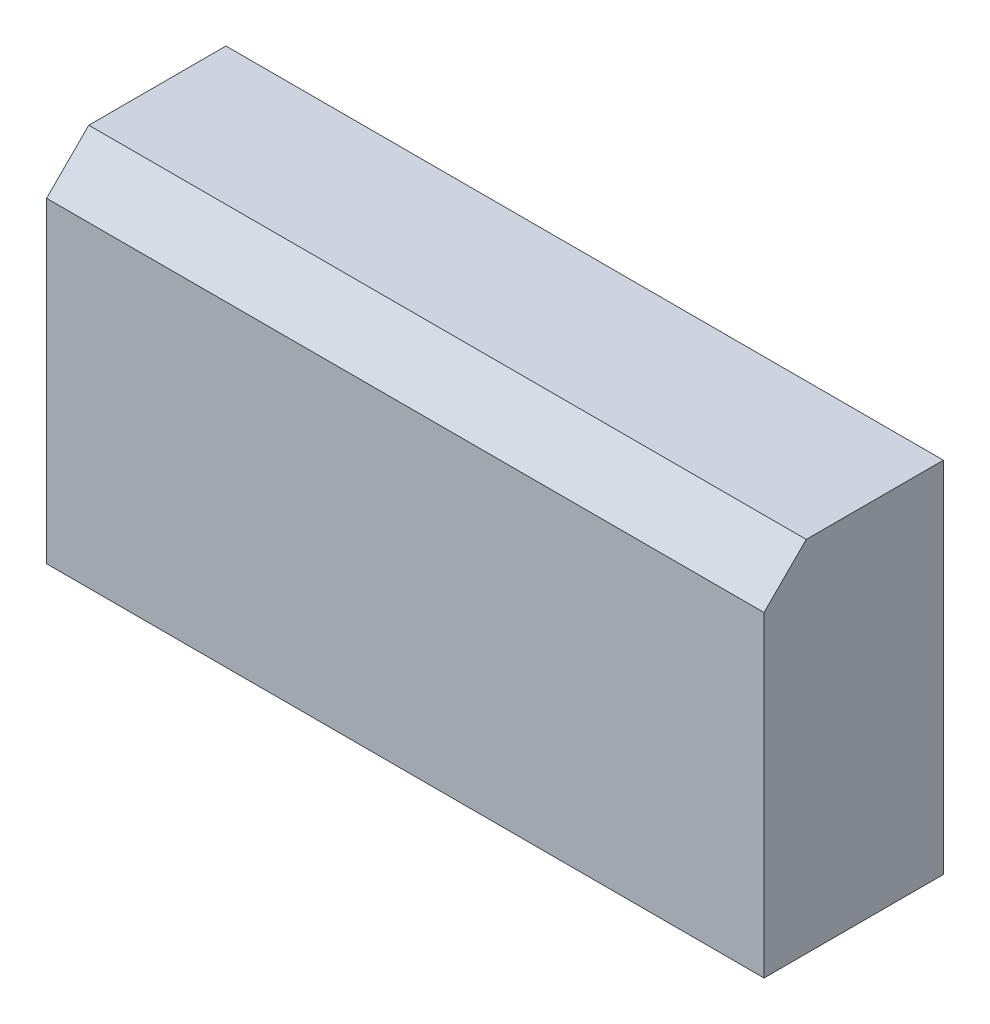
ISO-10303-21;
HEADER;
FILE_DESCRIPTION(('STEP AP214'),'2;1');
FILE_NAME('part.step','',(''),(''),'','','');
FILE_SCHEMA(('AUTOMOTIVE_DESIGN { 1 0 10303 214 1 1 1 1 }'));
ENDSEC;
DATA;
#1=APPLICATION_CONTEXT('core data for automotive mechanical design processes');
#2=APPLICATION_PROTOCOL_DEFINITION('international standard','automotive_design',2000,#1);
#3=PRODUCT_CONTEXT('',#1,'mechanical');
#4=PRODUCT('Part','Part','',(#3));
#5=PRODUCT_RELATED_PRODUCT_CATEGORY('part','',(#4));
#6=PRODUCT_DEFINITION_FORMATION('','',#4);
#7=PRODUCT_DEFINITION_CONTEXT('part definition',#1,'design');
#8=PRODUCT_DEFINITION('design','',#6,#7);
#9=PRODUCT_DEFINITION_SHAPE('','',#8);
#10=(LENGTH_UNIT() NAMED_UNIT(*) SI_UNIT(.MILLI.,.METRE.));
#11=(NAMED_UNIT(*) PLANE_ANGLE_UNIT() SI_UNIT($,.RADIAN.));
#12=(NAMED_UNIT(*) SI_UNIT($,.STERADIAN.) SOLID_ANGLE_UNIT());
#13=UNCERTAINTY_MEASURE_WITH_UNIT(LENGTH_MEASURE(1.E-05),#10,'distance_accuracy_value','');
#14=(GEOMETRIC_REPRESENTATION_CONTEXT(3) GLOBAL_UNCERTAINTY_ASSIGNED_CONTEXT((#13)) GLOBAL_UNIT_ASSIGNED_CONTEXT((#10,
#11,#12)) REPRESENTATION_CONTEXT('',''));
#15=CARTESIAN_POINT('',(0.,0.,0.));
#16=DIRECTION('',(0.,0.,1.));
#17=DIRECTION('',(1.,0.,0.));
#18=AXIS2_PLACEMENT_3D('',#15,#16,#17);
#19=CARTESIAN_POINT('',(14.25,17.,11.25));
#20=DIRECTION('',(0.,0.,1.));
#21=DIRECTION('',(1.,0.,0.));
#22=AXIS2_PLACEMENT_3D('',#19,#20,#21);
#23=PLANE('',#22);
#24=DIRECTION('',(0.,-1.,0.));
#25=VECTOR('',#24,1.);
#26=CARTESIAN_POINT('',(3.4,13.6,11.25));
#27=LINE('',#26,#25);
#28=CARTESIAN_POINT('',(3.4,16.6,11.25));
#29=VERTEX_POINT('',#28);
#30=CARTESIAN_POINT('',(3.4,13.6,11.25));
#31=VERTEX_POINT('',#30);
#32=EDGE_CURVE('E65',#29,#31,#27,.T.);
#33=ORIENTED_EDGE('',*,*,#32,.F.);
#34=DIRECTION('',(1.,0.,0.));
#35=VECTOR('',#34,1.);
#36=CARTESIAN_POINT('',(0.,16.6,11.25));
#37=LINE('',#36,#35);
#38=CARTESIAN_POINT('',(-3.4,16.6,11.25));
#39=VERTEX_POINT('',#38);
#40=EDGE_CURVE('E11',#39,#29,#37,.T.);
#41=ORIENTED_EDGE('',*,*,#40,.F.);
#42=DIRECTION('',(0.,1.,0.));
#43=VECTOR('',#42,1.);
#44=CARTESIAN_POINT('',(-3.4,17.,11.25));
#45=LINE('',#44,#43);
#46=CARTESIAN_POINT('',(-3.4,13.6,11.25));
#47=VERTEX_POINT('',#46);
#48=EDGE_CURVE('E68',#47,#39,#45,.T.);
#49=ORIENTED_EDGE('',*,*,#48,.F.);
#50=DIRECTION('',(-1.,0.,0.));
#51=VECTOR('',#50,1.);
#52=CARTESIAN_POINT('',(-3.4,13.6,11.25));
#53=LINE('',#52,#51);
#54=EDGE_CURVE('E62',#31,#47,#53,.T.);
#55=ORIENTED_EDGE('',*,*,#54,.F.);
#56=EDGE_LOOP('',(#33,#41,#49,#55));
#57=FACE_BOUND('',#56,.T.);
#58=ADVANCED_FACE('F16',(#57),#23,.T.);
#59=CARTESIAN_POINT('',(0.,16.8,11.05));
#60=DIRECTION('',(0.,0.707106781186498,0.707106781186598));
#61=DIRECTION('',(1.,0.,0.));
#62=AXIS2_PLACEMENT_3D('',#59,#60,#61);
#63=PLANE('',#62);
#64=DIRECTION('',(1.,0.,0.));
#65=VECTOR('',#64,1.);
#66=CARTESIAN_POINT('',(3.4,17.,10.85));
#67=LINE('',#66,#65);
#68=CARTESIAN_POINT('',(-3.4,17.,10.85));
#69=VERTEX_POINT('',#68);
#70=CARTESIAN_POINT('',(3.4,17.,10.85));
#71=VERTEX_POINT('',#70);
#72=EDGE_CURVE('E130',#69,#71,#67,.T.);
#73=ORIENTED_EDGE('',*,*,#72,.F.);
#74=DIRECTION('',(0.,0.707106781186549,-0.707106781186546));
#75=VECTOR('',#74,1.);
#76=CARTESIAN_POINT('',(-3.4,16.6,11.25));
#77=LINE('',#76,#75);
#78=EDGE_CURVE('E27',#39,#69,#77,.T.);
#79=ORIENTED_EDGE('',*,*,#78,.F.);
#80=ORIENTED_EDGE('',*,*,#40,.T.);
#81=DIRECTION('',(0.,-0.707106781186549,0.707106781186546));
#82=VECTOR('',#81,1.);
#83=CARTESIAN_POINT('',(3.4,17.,10.85));
#84=LINE('',#83,#82);
#85=EDGE_CURVE('E20',#71,#29,#84,.T.);
#86=ORIENTED_EDGE('',*,*,#85,.F.);
#87=EDGE_LOOP('',(#73,#79,#80,#86));
#88=FACE_BOUND('',#87,.T.);
#89=ADVANCED_FACE('F18',(#88),#63,.T.);
#90=CARTESIAN_POINT('',(-3.4,17.,9.55));
#91=DIRECTION('',(-1.,0.,0.));
#92=DIRECTION('',(0.,0.,1.));
#93=AXIS2_PLACEMENT_3D('',#90,#91,#92);
#94=PLANE('',#93);
#95=ORIENTED_EDGE('',*,*,#48,.T.);
#96=ORIENTED_EDGE('',*,*,#78,.T.);
#97=DIRECTION('',(0.,0.,1.));
#98=VECTOR('',#97,1.);
#99=CARTESIAN_POINT('',(-3.4,17.,9.55));
#100=LINE('',#99,#98);
#101=CARTESIAN_POINT('',(-3.4,17.,9.55));
#102=VERTEX_POINT('',#101);
#103=EDGE_CURVE('E112',#102,#69,#100,.T.);
#104=ORIENTED_EDGE('',*,*,#103,.F.);
#105=DIRECTION('',(0.,-1.,0.));
#106=VECTOR('',#105,1.);
#107=CARTESIAN_POINT('',(-3.4,13.5,9.55));
#108=LINE('',#107,#106);
#109=CARTESIAN_POINT('',(-3.4,13.6,9.55));
#110=VERTEX_POINT('',#109);
#111=EDGE_CURVE('E109',#102,#110,#108,.T.);
#112=ORIENTED_EDGE('',*,*,#111,.T.);
#113=DIRECTION('',(0.,0.,-1.));
#114=VECTOR('',#113,1.);
#115=CARTESIAN_POINT('',(-3.4,13.6,9.55));
#116=LINE('',#115,#114);
#117=EDGE_CURVE('E73',#47,#110,#116,.T.);
#118=ORIENTED_EDGE('',*,*,#117,.F.);
#119=EDGE_LOOP('',(#95,#96,#104,#112,#118));
#120=FACE_BOUND('',#119,.T.);
#121=ADVANCED_FACE('F110',(#120),#94,.T.);
#122=CARTESIAN_POINT('',(-3.4,13.6,9.55));
#123=DIRECTION('',(0.,-1.,0.));
#124=DIRECTION('',(0.,0.,-1.));
#125=AXIS2_PLACEMENT_3D('',#122,#123,#124);
#126=PLANE('',#125);
#127=ORIENTED_EDGE('',*,*,#117,.T.);
#128=DIRECTION('',(1.,0.,0.));
#129=VECTOR('',#128,1.);
#130=CARTESIAN_POINT('',(0.,13.6,9.55));
#131=LINE('',#130,#129);
#132=CARTESIAN_POINT('',(3.4,13.6,9.55));
#133=VERTEX_POINT('',#132);
#134=EDGE_CURVE('E81',#110,#133,#131,.T.);
#135=ORIENTED_EDGE('',*,*,#134,.T.);
#136=DIRECTION('',(0.,0.,-1.));
#137=VECTOR('',#136,1.);
#138=CARTESIAN_POINT('',(3.4,13.6,9.55));
#139=LINE('',#138,#137);
#140=EDGE_CURVE('E77',#31,#133,#139,.T.);
#141=ORIENTED_EDGE('',*,*,#140,.F.);
#142=ORIENTED_EDGE('',*,*,#54,.T.);
#143=EDGE_LOOP('',(#127,#135,#141,#142));
#144=FACE_BOUND('',#143,.T.);
#145=ADVANCED_FACE('F78',(#144),#126,.T.);
#146=CARTESIAN_POINT('',(3.4,13.6,9.55));
#147=DIRECTION('',(1.,0.,0.));
#148=DIRECTION('',(0.,1.,0.));
#149=AXIS2_PLACEMENT_3D('',#146,#147,#148);
#150=PLANE('',#149);
#151=DIRECTION('',(0.,0.,-1.));
#152=VECTOR('',#151,1.);
#153=CARTESIAN_POINT('',(3.4,17.,9.55));
#154=LINE('',#153,#152);
#155=CARTESIAN_POINT('',(3.4,17.,9.55));
#156=VERTEX_POINT('',#155);
#157=EDGE_CURVE('E96',#71,#156,#154,.T.);
#158=ORIENTED_EDGE('',*,*,#157,.F.);
#159=ORIENTED_EDGE('',*,*,#85,.T.);
#160=ORIENTED_EDGE('',*,*,#32,.T.);
#161=ORIENTED_EDGE('',*,*,#140,.T.);
#162=DIRECTION('',(0.,1.,0.));
#163=VECTOR('',#162,1.);
#164=CARTESIAN_POINT('',(3.4,13.5,9.55));
#165=LINE('',#164,#163);
#166=EDGE_CURVE('E120',#133,#156,#165,.T.);
#167=ORIENTED_EDGE('',*,*,#166,.T.);
#168=EDGE_LOOP('',(#158,#159,#160,#161,#167));
#169=FACE_BOUND('',#168,.T.);
#170=ADVANCED_FACE('F88',(#169),#150,.T.);
#171=CARTESIAN_POINT('',(3.4,17.,9.55));
#172=DIRECTION('',(0.,1.,0.));
#173=DIRECTION('',(1.,0.,0.));
#174=AXIS2_PLACEMENT_3D('',#171,#172,#173);
#175=PLANE('',#174);
#176=ORIENTED_EDGE('',*,*,#103,.T.);
#177=ORIENTED_EDGE('',*,*,#72,.T.);
#178=ORIENTED_EDGE('',*,*,#157,.T.);
#179=DIRECTION('',(-1.,0.,0.));
#180=VECTOR('',#179,1.);
#181=CARTESIAN_POINT('',(0.,17.,9.55));
#182=LINE('',#181,#180);
#183=EDGE_CURVE('E117',#156,#102,#182,.T.);
#184=ORIENTED_EDGE('',*,*,#183,.T.);
#185=EDGE_LOOP('',(#176,#177,#178,#184));
#186=FACE_BOUND('',#185,.T.);
#187=ADVANCED_FACE('F139',(#186),#175,.T.);
#188=CARTESIAN_POINT('',(0.,13.5,9.55));
#189=DIRECTION('',(0.,0.,1.));
#190=DIRECTION('',(1.,0.,0.));
#191=AXIS2_PLACEMENT_3D('',#188,#189,#190);
#192=PLANE('',#191);
#193=ORIENTED_EDGE('',*,*,#166,.F.);
#194=ORIENTED_EDGE('',*,*,#134,.F.);
#195=ORIENTED_EDGE('',*,*,#111,.F.);
#196=ORIENTED_EDGE('',*,*,#183,.F.);
#197=EDGE_LOOP('',(#193,#194,#195,#196));
#198=FACE_BOUND('',#197,.T.);
#199=ADVANCED_FACE('F119',(#198),#192,.F.);
#200=CLOSED_SHELL('',(#58,#89,#121,#145,#170,#187,#199));
#201=MANIFOLD_SOLID_BREP('B1',#200);
#202=ADVANCED_BREP_SHAPE_REPRESENTATION('',(#18,#201),#14);
#203=SHAPE_DEFINITION_REPRESENTATION(#9,#202);
ENDSEC;
END-ISO-10303-21;
